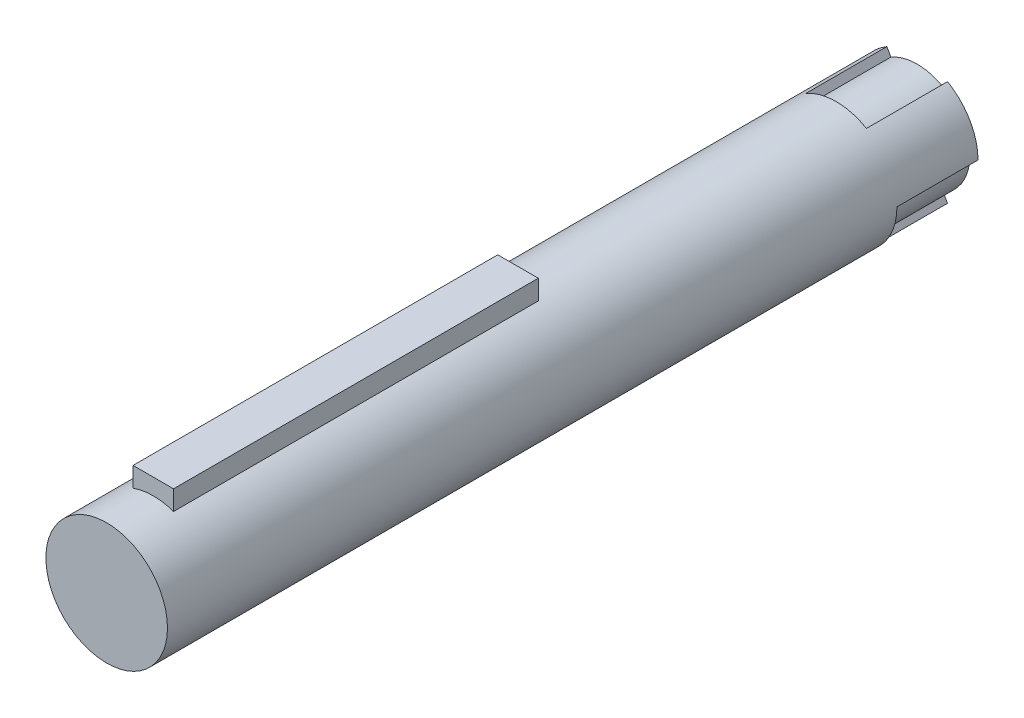
ISO-10303-21;
HEADER;
FILE_DESCRIPTION(('STEP AP214'),'2;1');
FILE_NAME('part.step','',(''),(''),'','','');
FILE_SCHEMA(('AUTOMOTIVE_DESIGN { 1 0 10303 214 1 1 1 1 }'));
ENDSEC;
DATA;
#1=APPLICATION_CONTEXT('core data for automotive mechanical design processes');
#2=APPLICATION_PROTOCOL_DEFINITION('international standard','automotive_design',2000,#1);
#3=PRODUCT_CONTEXT('',#1,'mechanical');
#4=PRODUCT('Part','Part','',(#3));
#5=PRODUCT_RELATED_PRODUCT_CATEGORY('part','',(#4));
#6=PRODUCT_DEFINITION_FORMATION('','',#4);
#7=PRODUCT_DEFINITION_CONTEXT('part definition',#1,'design');
#8=PRODUCT_DEFINITION('design','',#6,#7);
#9=PRODUCT_DEFINITION_SHAPE('','',#8);
#10=(LENGTH_UNIT() NAMED_UNIT(*) SI_UNIT(.MILLI.,.METRE.));
#11=(NAMED_UNIT(*) PLANE_ANGLE_UNIT() SI_UNIT($,.RADIAN.));
#12=(NAMED_UNIT(*) SI_UNIT($,.STERADIAN.) SOLID_ANGLE_UNIT());
#13=UNCERTAINTY_MEASURE_WITH_UNIT(LENGTH_MEASURE(1.E-05),#10,'distance_accuracy_value','');
#14=(GEOMETRIC_REPRESENTATION_CONTEXT(3) GLOBAL_UNCERTAINTY_ASSIGNED_CONTEXT((#13)) GLOBAL_UNIT_ASSIGNED_CONTEXT((#10,
#11,#12)) REPRESENTATION_CONTEXT('',''));
#15=CARTESIAN_POINT('',(0.,0.,0.));
#16=DIRECTION('',(0.,0.,1.));
#17=DIRECTION('',(1.,0.,0.));
#18=AXIS2_PLACEMENT_3D('',#15,#16,#17);
#19=CARTESIAN_POINT('',(0.,0.,-100.));
#20=DIRECTION('',(0.,0.,1.));
#21=DIRECTION('',(1.,0.,0.));
#22=AXIS2_PLACEMENT_3D('',#19,#20,#21);
#23=CYLINDRICAL_SURFACE('',#22,7.5);
#24=CARTESIAN_POINT('',(0.,0.,0.));
#25=DIRECTION('',(0.,0.,1.));
#26=DIRECTION('',(1.,0.,0.));
#27=AXIS2_PLACEMENT_3D('',#24,#25,#26);
#28=CIRCLE('',#27,7.5);
#29=CARTESIAN_POINT('',(7.5,0.,0.));
#30=VERTEX_POINT('',#29);
#31=EDGE_CURVE('E256',#30,#30,#28,.T.);
#32=ORIENTED_EDGE('',*,*,#31,.F.);
#33=EDGE_LOOP('',(#32));
#34=FACE_BOUND('',#33,.T.);
#35=CARTESIAN_POINT('',(0.,0.,-50.75));
#36=DIRECTION('',(0.,0.,1.));
#37=DIRECTION('',(1.,0.,0.));
#38=AXIS2_PLACEMENT_3D('',#35,#36,#37);
#39=CIRCLE('',#38,7.5);
#40=CARTESIAN_POINT('',(-2.5,7.07106781186548,-50.75));
#41=VERTEX_POINT('',#40);
#42=CARTESIAN_POINT('',(2.5,7.07106781186547,-50.75));
#43=VERTEX_POINT('',#42);
#44=EDGE_CURVE('E40',#41,#43,#39,.F.);
#45=ORIENTED_EDGE('',*,*,#44,.T.);
#46=DIRECTION('',(0.,0.,1.));
#47=VECTOR('',#46,1.);
#48=CARTESIAN_POINT('',(2.50000000000001,7.07106781186547,-100.));
#49=LINE('',#48,#47);
#50=CARTESIAN_POINT('',(2.5,7.07106781186548,-5.75000000000001));
#51=VERTEX_POINT('',#50);
#52=EDGE_CURVE('E11',#43,#51,#49,.T.);
#53=ORIENTED_EDGE('',*,*,#52,.T.);
#54=CARTESIAN_POINT('',(0.,0.,-5.75000000000001));
#55=DIRECTION('',(0.,0.,-1.));
#56=DIRECTION('',(-1.,0.,0.));
#57=AXIS2_PLACEMENT_3D('',#54,#55,#56);
#58=CIRCLE('',#57,7.5);
#59=CARTESIAN_POINT('',(-2.5,7.07106781186548,-5.75000000000001));
#60=VERTEX_POINT('',#59);
#61=EDGE_CURVE('E260',#51,#60,#58,.F.);
#62=ORIENTED_EDGE('',*,*,#61,.T.);
#63=DIRECTION('',(0.,0.,1.));
#64=VECTOR('',#63,1.);
#65=CARTESIAN_POINT('',(-2.49999999999999,7.07106781186548,-100.));
#66=LINE('',#65,#64);
#67=EDGE_CURVE('E267',#60,#41,#66,.F.);
#68=ORIENTED_EDGE('',*,*,#67,.T.);
#69=EDGE_LOOP('',(#45,#53,#62,#68));
#70=FACE_BOUND('',#69,.T.);
#71=CARTESIAN_POINT('',(0.,0.,-100.));
#72=DIRECTION('',(0.,0.,1.));
#73=DIRECTION('',(1.,0.,0.));
#74=AXIS2_PLACEMENT_3D('',#71,#72,#73);
#75=CIRCLE('',#74,7.5);
#76=CARTESIAN_POINT('',(-3.74165738677394,6.5,-100.));
#77=VERTEX_POINT('',#76);
#78=CARTESIAN_POINT('',(-7.5,0.,-100.));
#79=VERTEX_POINT('',#78);
#80=EDGE_CURVE('E257',#77,#79,#75,.T.);
#81=ORIENTED_EDGE('',*,*,#80,.T.);
#82=DIRECTION('',(0.,0.,-1.));
#83=VECTOR('',#82,1.);
#84=CARTESIAN_POINT('',(-7.5,0.,-90.));
#85=LINE('',#84,#83);
#86=CARTESIAN_POINT('',(-7.5,0.,-90.));
#87=VERTEX_POINT('',#86);
#88=EDGE_CURVE('E180',#87,#79,#85,.T.);
#89=ORIENTED_EDGE('',*,*,#88,.F.);
#90=CARTESIAN_POINT('',(0.,0.,-90.));
#91=DIRECTION('',(0.,0.,-1.));
#92=DIRECTION('',(-1.,0.,0.));
#93=AXIS2_PLACEMENT_3D('',#90,#91,#92);
#94=CIRCLE('',#93,7.5);
#95=CARTESIAN_POINT('',(-4.70481529320336,-5.8407801753567,-90.));
#96=VERTEX_POINT('',#95);
#97=EDGE_CURVE('E166',#96,#87,#94,.T.);
#98=ORIENTED_EDGE('',*,*,#97,.F.);
#99=DIRECTION('',(0.,0.,-1.));
#100=VECTOR('',#99,1.);
#101=CARTESIAN_POINT('',(-4.70481529320336,-5.8407801753567,-90.));
#102=LINE('',#101,#100);
#103=CARTESIAN_POINT('',(-4.70481529320336,-5.8407801753567,-100.));
#104=VERTEX_POINT('',#103);
#105=EDGE_CURVE('E153',#96,#104,#102,.T.);
#106=ORIENTED_EDGE('',*,*,#105,.T.);
#107=CARTESIAN_POINT('',(3.74165738677394,-6.5,-100.));
#108=VERTEX_POINT('',#107);
#109=EDGE_CURVE('E261',#104,#108,#75,.T.);
#110=ORIENTED_EDGE('',*,*,#109,.T.);
#111=DIRECTION('',(0.,0.,-1.));
#112=VECTOR('',#111,1.);
#113=CARTESIAN_POINT('',(3.74165738677394,-6.5,-90.));
#114=LINE('',#113,#112);
#115=CARTESIAN_POINT('',(3.74165738677394,-6.5,-90.));
#116=VERTEX_POINT('',#115);
#117=EDGE_CURVE('E202',#116,#108,#114,.T.);
#118=ORIENTED_EDGE('',*,*,#117,.F.);
#119=CARTESIAN_POINT('',(0.,0.,-90.));
#120=DIRECTION('',(0.,0.,-1.));
#121=DIRECTION('',(-1.,0.,0.));
#122=AXIS2_PLACEMENT_3D('',#119,#120,#121);
#123=CIRCLE('',#122,7.5);
#124=CARTESIAN_POINT('',(7.5,0.,-90.));
#125=VERTEX_POINT('',#124);
#126=EDGE_CURVE('E190',#125,#116,#123,.T.);
#127=ORIENTED_EDGE('',*,*,#126,.F.);
#128=DIRECTION('',(0.,0.,-1.));
#129=VECTOR('',#128,1.);
#130=CARTESIAN_POINT('',(7.5,0.,-90.));
#131=LINE('',#130,#129);
#132=CARTESIAN_POINT('',(7.5,0.,-100.));
#133=VERTEX_POINT('',#132);
#134=EDGE_CURVE('E204',#125,#133,#131,.T.);
#135=ORIENTED_EDGE('',*,*,#134,.T.);
#136=CARTESIAN_POINT('',(3.74165738677394,6.5,-100.));
#137=VERTEX_POINT('',#136);
#138=EDGE_CURVE('E262',#133,#137,#75,.T.);
#139=ORIENTED_EDGE('',*,*,#138,.T.);
#140=DIRECTION('',(0.,0.,-1.));
#141=VECTOR('',#140,1.);
#142=CARTESIAN_POINT('',(3.74165738677394,6.5,-90.));
#143=LINE('',#142,#141);
#144=CARTESIAN_POINT('',(3.74165738677394,6.5,-90.));
#145=VERTEX_POINT('',#144);
#146=EDGE_CURVE('E229',#145,#137,#143,.T.);
#147=ORIENTED_EDGE('',*,*,#146,.F.);
#148=CARTESIAN_POINT('',(0.,0.,-90.));
#149=DIRECTION('',(0.,0.,-1.));
#150=DIRECTION('',(-1.,0.,0.));
#151=AXIS2_PLACEMENT_3D('',#148,#149,#150);
#152=CIRCLE('',#151,7.5);
#153=CARTESIAN_POINT('',(-3.74165738677394,6.5,-90.));
#154=VERTEX_POINT('',#153);
#155=EDGE_CURVE('E214',#154,#145,#152,.T.);
#156=ORIENTED_EDGE('',*,*,#155,.F.);
#157=DIRECTION('',(0.,0.,-1.));
#158=VECTOR('',#157,1.);
#159=CARTESIAN_POINT('',(-3.74165738677394,6.5,-90.));
#160=LINE('',#159,#158);
#161=EDGE_CURVE('E232',#154,#77,#160,.T.);
#162=ORIENTED_EDGE('',*,*,#161,.T.);
#163=EDGE_LOOP('',(#81,#89,#98,#106,#110,#118,#127,#135,#139,#147,#156,#162));
#164=FACE_BOUND('',#163,.T.);
#165=ADVANCED_FACE('F33',(#34,#70,#164),#23,.T.);
#166=CARTESIAN_POINT('',(0.,0.,-100.));
#167=DIRECTION('',(0.,0.,1.));
#168=DIRECTION('',(1.,0.,0.));
#169=AXIS2_PLACEMENT_3D('',#166,#167,#168);
#170=PLANE('',#169);
#171=DIRECTION('',(-1.,0.,0.));
#172=VECTOR('',#171,1.);
#173=CARTESIAN_POINT('',(0.,0.,-100.));
#174=LINE('',#173,#172);
#175=CARTESIAN_POINT('',(-6.5,0.,-100.));
#176=VERTEX_POINT('',#175);
#177=EDGE_CURVE('E162',#176,#79,#174,.T.);
#178=ORIENTED_EDGE('',*,*,#177,.T.);
#179=ORIENTED_EDGE('',*,*,#80,.F.);
#180=DIRECTION('',(-0.498887651569859,0.866666666666667,0.));
#181=VECTOR('',#180,1.);
#182=CARTESIAN_POINT('',(0.,0.,-100.));
#183=LINE('',#182,#181);
#184=CARTESIAN_POINT('',(-3.24276973520408,5.63333333333334,-100.));
#185=VERTEX_POINT('',#184);
#186=EDGE_CURVE('E222',#185,#77,#183,.T.);
#187=ORIENTED_EDGE('',*,*,#186,.F.);
#188=CARTESIAN_POINT('',(0.,0.,-100.));
#189=DIRECTION('',(0.,0.,-1.));
#190=DIRECTION('',(-1.,0.,0.));
#191=AXIS2_PLACEMENT_3D('',#188,#189,#190);
#192=CIRCLE('',#191,6.5);
#193=CARTESIAN_POINT('',(3.24276973520408,5.63333333333333,-100.));
#194=VERTEX_POINT('',#193);
#195=EDGE_CURVE('E179',#185,#194,#192,.T.);
#196=ORIENTED_EDGE('',*,*,#195,.T.);
#197=DIRECTION('',(-0.498887651569859,-0.866666666666667,0.));
#198=VECTOR('',#197,1.);
#199=CARTESIAN_POINT('',(0.,0.,-100.));
#200=LINE('',#199,#198);
#201=EDGE_CURVE('E211',#137,#194,#200,.T.);
#202=ORIENTED_EDGE('',*,*,#201,.F.);
#203=ORIENTED_EDGE('',*,*,#138,.F.);
#204=DIRECTION('',(1.,0.,0.));
#205=VECTOR('',#204,1.);
#206=CARTESIAN_POINT('',(0.,0.,-100.));
#207=LINE('',#206,#205);
#208=CARTESIAN_POINT('',(6.5,0.,-100.));
#209=VERTEX_POINT('',#208);
#210=EDGE_CURVE('E197',#209,#133,#207,.T.);
#211=ORIENTED_EDGE('',*,*,#210,.F.);
#212=CARTESIAN_POINT('',(0.,0.,-100.));
#213=DIRECTION('',(0.,0.,-1.));
#214=DIRECTION('',(-1.,0.,0.));
#215=AXIS2_PLACEMENT_3D('',#212,#213,#214);
#216=CIRCLE('',#215,6.5);
#217=CARTESIAN_POINT('',(3.24276973520408,-5.63333333333333,-100.));
#218=VERTEX_POINT('',#217);
#219=EDGE_CURVE('E55',#209,#218,#216,.T.);
#220=ORIENTED_EDGE('',*,*,#219,.T.);
#221=DIRECTION('',(0.498887651569859,-0.866666666666667,0.));
#222=VECTOR('',#221,1.);
#223=CARTESIAN_POINT('',(0.,0.,-100.));
#224=LINE('',#223,#222);
#225=EDGE_CURVE('E187',#218,#108,#224,.T.);
#226=ORIENTED_EDGE('',*,*,#225,.T.);
#227=ORIENTED_EDGE('',*,*,#109,.F.);
#228=DIRECTION('',(-0.627308705760448,-0.778770690047559,0.));
#229=VECTOR('',#228,1.);
#230=CARTESIAN_POINT('',(0.,0.,-100.));
#231=LINE('',#230,#229);
#232=CARTESIAN_POINT('',(-4.07750658744291,-5.06200948530914,-100.));
#233=VERTEX_POINT('',#232);
#234=EDGE_CURVE('E172',#233,#104,#231,.T.);
#235=ORIENTED_EDGE('',*,*,#234,.F.);
#236=CARTESIAN_POINT('',(0.,0.,-100.));
#237=DIRECTION('',(0.,0.,-1.));
#238=DIRECTION('',(-1.,0.,0.));
#239=AXIS2_PLACEMENT_3D('',#236,#237,#238);
#240=CIRCLE('',#239,6.5);
#241=EDGE_CURVE('E47',#233,#176,#240,.T.);
#242=ORIENTED_EDGE('',*,*,#241,.T.);
#243=EDGE_LOOP('',(#178,#179,#187,#196,#202,#203,#211,#220,#226,#227,#235,#242));
#244=FACE_BOUND('',#243,.T.);
#245=ADVANCED_FACE('F300',(#244),#170,.F.);
#246=CARTESIAN_POINT('',(0.,0.,0.));
#247=DIRECTION('',(0.,0.,1.));
#248=DIRECTION('',(1.,0.,0.));
#249=AXIS2_PLACEMENT_3D('',#246,#247,#248);
#250=PLANE('',#249);
#251=ORIENTED_EDGE('',*,*,#31,.T.);
#252=EDGE_LOOP('',(#251));
#253=FACE_BOUND('',#252,.T.);
#254=ADVANCED_FACE('F305',(#253),#250,.T.);
#255=CARTESIAN_POINT('',(2.5,9.5,-5.75));
#256=DIRECTION('',(-1.,0.,0.));
#257=DIRECTION('',(0.,0.,1.));
#258=AXIS2_PLACEMENT_3D('',#255,#256,#257);
#259=PLANE('',#258);
#260=ORIENTED_EDGE('',*,*,#52,.F.);
#261=DIRECTION('',(0.,-1.,0.));
#262=VECTOR('',#261,1.);
#263=CARTESIAN_POINT('',(2.5,9.5,-50.75));
#264=LINE('',#263,#262);
#265=CARTESIAN_POINT('',(2.5,9.5,-50.75));
#266=VERTEX_POINT('',#265);
#267=EDGE_CURVE('E253',#266,#43,#264,.T.);
#268=ORIENTED_EDGE('',*,*,#267,.F.);
#269=DIRECTION('',(0.,0.,-1.));
#270=VECTOR('',#269,1.);
#271=CARTESIAN_POINT('',(2.5,9.5,-5.75));
#272=LINE('',#271,#270);
#273=CARTESIAN_POINT('',(2.5,9.5,-5.75));
#274=VERTEX_POINT('',#273);
#275=EDGE_CURVE('E228',#274,#266,#272,.T.);
#276=ORIENTED_EDGE('',*,*,#275,.F.);
#277=DIRECTION('',(0.,-1.,0.));
#278=VECTOR('',#277,1.);
#279=CARTESIAN_POINT('',(2.5,9.5,-5.75));
#280=LINE('',#279,#278);
#281=EDGE_CURVE('E245',#274,#51,#280,.T.);
#282=ORIENTED_EDGE('',*,*,#281,.T.);
#283=EDGE_LOOP('',(#260,#268,#276,#282));
#284=FACE_BOUND('',#283,.T.);
#285=ADVANCED_FACE('F287',(#284),#259,.F.);
#286=CARTESIAN_POINT('',(-2.5,9.5,-50.75));
#287=DIRECTION('',(0.,0.,1.));
#288=DIRECTION('',(1.,0.,0.));
#289=AXIS2_PLACEMENT_3D('',#286,#287,#288);
#290=PLANE('',#289);
#291=ORIENTED_EDGE('',*,*,#44,.F.);
#292=DIRECTION('',(0.,-1.,0.));
#293=VECTOR('',#292,1.);
#294=CARTESIAN_POINT('',(-2.5,9.5,-50.75));
#295=LINE('',#294,#293);
#296=CARTESIAN_POINT('',(-2.5,9.5,-50.75));
#297=VERTEX_POINT('',#296);
#298=EDGE_CURVE('E250',#297,#41,#295,.T.);
#299=ORIENTED_EDGE('',*,*,#298,.F.);
#300=DIRECTION('',(-1.,0.,0.));
#301=VECTOR('',#300,1.);
#302=CARTESIAN_POINT('',(-2.5,9.5,-50.75));
#303=LINE('',#302,#301);
#304=EDGE_CURVE('E239',#266,#297,#303,.T.);
#305=ORIENTED_EDGE('',*,*,#304,.F.);
#306=ORIENTED_EDGE('',*,*,#267,.T.);
#307=EDGE_LOOP('',(#291,#299,#305,#306));
#308=FACE_BOUND('',#307,.T.);
#309=ADVANCED_FACE('F275',(#308),#290,.F.);
#310=CARTESIAN_POINT('',(-2.5,9.5,-5.75));
#311=DIRECTION('',(1.,0.,0.));
#312=DIRECTION('',(0.,0.,-1.));
#313=AXIS2_PLACEMENT_3D('',#310,#311,#312);
#314=PLANE('',#313);
#315=ORIENTED_EDGE('',*,*,#67,.F.);
#316=DIRECTION('',(0.,-1.,0.));
#317=VECTOR('',#316,1.);
#318=CARTESIAN_POINT('',(-2.5,9.5,-5.75));
#319=LINE('',#318,#317);
#320=CARTESIAN_POINT('',(-2.5,9.5,-5.75));
#321=VERTEX_POINT('',#320);
#322=EDGE_CURVE('E248',#321,#60,#319,.T.);
#323=ORIENTED_EDGE('',*,*,#322,.F.);
#324=DIRECTION('',(0.,0.,1.));
#325=VECTOR('',#324,1.);
#326=CARTESIAN_POINT('',(-2.5,9.5,-5.75));
#327=LINE('',#326,#325);
#328=EDGE_CURVE('E241',#297,#321,#327,.T.);
#329=ORIENTED_EDGE('',*,*,#328,.F.);
#330=ORIENTED_EDGE('',*,*,#298,.T.);
#331=EDGE_LOOP('',(#315,#323,#329,#330));
#332=FACE_BOUND('',#331,.T.);
#333=ADVANCED_FACE('F279',(#332),#314,.F.);
#334=CARTESIAN_POINT('',(-2.5,9.5,-5.75));
#335=DIRECTION('',(0.,0.,-1.));
#336=DIRECTION('',(-1.,0.,0.));
#337=AXIS2_PLACEMENT_3D('',#334,#335,#336);
#338=PLANE('',#337);
#339=ORIENTED_EDGE('',*,*,#61,.F.);
#340=ORIENTED_EDGE('',*,*,#281,.F.);
#341=DIRECTION('',(1.,0.,0.));
#342=VECTOR('',#341,1.);
#343=CARTESIAN_POINT('',(-2.5,9.5,-5.75));
#344=LINE('',#343,#342);
#345=EDGE_CURVE('E243',#321,#274,#344,.T.);
#346=ORIENTED_EDGE('',*,*,#345,.F.);
#347=ORIENTED_EDGE('',*,*,#322,.T.);
#348=EDGE_LOOP('',(#339,#340,#346,#347));
#349=FACE_BOUND('',#348,.T.);
#350=ADVANCED_FACE('F289',(#349),#338,.F.);
#351=CARTESIAN_POINT('',(0.,9.5,0.));
#352=DIRECTION('',(0.,-1.,0.));
#353=DIRECTION('',(0.,0.,-1.));
#354=AXIS2_PLACEMENT_3D('',#351,#352,#353);
#355=PLANE('',#354);
#356=ORIENTED_EDGE('',*,*,#275,.T.);
#357=ORIENTED_EDGE('',*,*,#304,.T.);
#358=ORIENTED_EDGE('',*,*,#328,.T.);
#359=ORIENTED_EDGE('',*,*,#345,.T.);
#360=EDGE_LOOP('',(#356,#357,#358,#359));
#361=FACE_BOUND('',#360,.T.);
#362=ADVANCED_FACE('F283',(#361),#355,.F.);
#363=CARTESIAN_POINT('',(0.,0.,-90.));
#364=DIRECTION('',(0.,0.,-1.));
#365=DIRECTION('',(-1.,0.,0.));
#366=AXIS2_PLACEMENT_3D('',#363,#364,#365);
#367=CYLINDRICAL_SURFACE('',#366,6.5);
#368=ORIENTED_EDGE('',*,*,#195,.F.);
#369=DIRECTION('',(0.,0.,-1.));
#370=VECTOR('',#369,1.);
#371=CARTESIAN_POINT('',(-3.24276973520408,5.63333333333333,-90.));
#372=LINE('',#371,#370);
#373=CARTESIAN_POINT('',(-3.24276973520408,5.63333333333333,-90.));
#374=VERTEX_POINT('',#373);
#375=EDGE_CURVE('E219',#374,#185,#372,.T.);
#376=ORIENTED_EDGE('',*,*,#375,.F.);
#377=CARTESIAN_POINT('',(0.,0.,-90.));
#378=DIRECTION('',(0.,0.,-1.));
#379=DIRECTION('',(-1.,0.,0.));
#380=AXIS2_PLACEMENT_3D('',#377,#378,#379);
#381=CIRCLE('',#380,6.5);
#382=CARTESIAN_POINT('',(3.24276973520408,5.63333333333333,-90.));
#383=VERTEX_POINT('',#382);
#384=EDGE_CURVE('E208',#374,#383,#381,.T.);
#385=ORIENTED_EDGE('',*,*,#384,.T.);
#386=DIRECTION('',(0.,0.,-1.));
#387=VECTOR('',#386,1.);
#388=CARTESIAN_POINT('',(3.24276973520408,5.63333333333333,-90.));
#389=LINE('',#388,#387);
#390=EDGE_CURVE('E226',#383,#194,#389,.T.);
#391=ORIENTED_EDGE('',*,*,#390,.T.);
#392=EDGE_LOOP('',(#368,#376,#385,#391));
#393=FACE_BOUND('',#392,.T.);
#394=ADVANCED_FACE('F296',(#393),#367,.T.);
#395=CARTESIAN_POINT('',(0.,0.,-90.));
#396=DIRECTION('',(0.866666666666667,-0.498887651569859,0.));
#397=DIRECTION('',(0.498887651569859,0.866666666666667,0.));
#398=AXIS2_PLACEMENT_3D('',#395,#396,#397);
#399=PLANE('',#398);
#400=ORIENTED_EDGE('',*,*,#201,.T.);
#401=ORIENTED_EDGE('',*,*,#390,.F.);
#402=DIRECTION('',(-0.498887651569859,-0.866666666666667,0.));
#403=VECTOR('',#402,1.);
#404=CARTESIAN_POINT('',(0.,0.,-90.));
#405=LINE('',#404,#403);
#406=EDGE_CURVE('E216',#145,#383,#405,.T.);
#407=ORIENTED_EDGE('',*,*,#406,.F.);
#408=ORIENTED_EDGE('',*,*,#146,.T.);
#409=EDGE_LOOP('',(#400,#401,#407,#408));
#410=FACE_BOUND('',#409,.T.);
#411=ADVANCED_FACE('F344',(#410),#399,.F.);
#412=CARTESIAN_POINT('',(0.,0.,-90.));
#413=DIRECTION('',(-0.866666666666667,-0.498887651569859,0.));
#414=DIRECTION('',(0.498887651569859,-0.866666666666667,0.));
#415=AXIS2_PLACEMENT_3D('',#412,#413,#414);
#416=PLANE('',#415);
#417=ORIENTED_EDGE('',*,*,#186,.T.);
#418=ORIENTED_EDGE('',*,*,#161,.F.);
#419=DIRECTION('',(-0.498887651569859,0.866666666666667,0.));
#420=VECTOR('',#419,1.);
#421=CARTESIAN_POINT('',(0.,0.,-90.));
#422=LINE('',#421,#420);
#423=EDGE_CURVE('E210',#374,#154,#422,.T.);
#424=ORIENTED_EDGE('',*,*,#423,.F.);
#425=ORIENTED_EDGE('',*,*,#375,.T.);
#426=EDGE_LOOP('',(#417,#418,#424,#425));
#427=FACE_BOUND('',#426,.T.);
#428=ADVANCED_FACE('F354',(#427),#416,.F.);
#429=CARTESIAN_POINT('',(0.,0.,-90.));
#430=DIRECTION('',(0.,0.,-1.));
#431=DIRECTION('',(-1.,0.,0.));
#432=AXIS2_PLACEMENT_3D('',#429,#430,#431);
#433=PLANE('',#432);
#434=ORIENTED_EDGE('',*,*,#384,.F.);
#435=ORIENTED_EDGE('',*,*,#423,.T.);
#436=ORIENTED_EDGE('',*,*,#155,.T.);
#437=ORIENTED_EDGE('',*,*,#406,.T.);
#438=EDGE_LOOP('',(#434,#435,#436,#437));
#439=FACE_BOUND('',#438,.T.);
#440=ADVANCED_FACE('F364',(#439),#433,.T.);
#441=CARTESIAN_POINT('',(0.,0.,-90.));
#442=DIRECTION('',(0.,0.,-1.));
#443=DIRECTION('',(-1.,0.,0.));
#444=AXIS2_PLACEMENT_3D('',#441,#442,#443);
#445=CYLINDRICAL_SURFACE('',#444,6.5);
#446=ORIENTED_EDGE('',*,*,#219,.F.);
#447=DIRECTION('',(0.,0.,-1.));
#448=VECTOR('',#447,1.);
#449=CARTESIAN_POINT('',(6.5,0.,-90.));
#450=LINE('',#449,#448);
#451=CARTESIAN_POINT('',(6.5,0.,-90.));
#452=VERTEX_POINT('',#451);
#453=EDGE_CURVE('E195',#452,#209,#450,.T.);
#454=ORIENTED_EDGE('',*,*,#453,.F.);
#455=CARTESIAN_POINT('',(0.,0.,-90.));
#456=DIRECTION('',(0.,0.,-1.));
#457=DIRECTION('',(-1.,0.,0.));
#458=AXIS2_PLACEMENT_3D('',#455,#456,#457);
#459=CIRCLE('',#458,6.5);
#460=CARTESIAN_POINT('',(3.24276973520408,-5.63333333333333,-90.));
#461=VERTEX_POINT('',#460);
#462=EDGE_CURVE('E183',#452,#461,#459,.T.);
#463=ORIENTED_EDGE('',*,*,#462,.T.);
#464=DIRECTION('',(0.,0.,-1.));
#465=VECTOR('',#464,1.);
#466=CARTESIAN_POINT('',(3.24276973520408,-5.63333333333333,-90.));
#467=LINE('',#466,#465);
#468=EDGE_CURVE('E173',#461,#218,#467,.T.);
#469=ORIENTED_EDGE('',*,*,#468,.T.);
#470=EDGE_LOOP('',(#446,#454,#463,#469));
#471=FACE_BOUND('',#470,.T.);
#472=ADVANCED_FACE('F373',(#471),#445,.T.);
#473=CARTESIAN_POINT('',(0.,0.,-90.));
#474=DIRECTION('',(0.866666666666667,0.498887651569859,0.));
#475=DIRECTION('',(-0.498887651569859,0.866666666666667,0.));
#476=AXIS2_PLACEMENT_3D('',#473,#474,#475);
#477=PLANE('',#476);
#478=ORIENTED_EDGE('',*,*,#225,.F.);
#479=ORIENTED_EDGE('',*,*,#468,.F.);
#480=DIRECTION('',(0.498887651569859,-0.866666666666667,0.));
#481=VECTOR('',#480,1.);
#482=CARTESIAN_POINT('',(0.,0.,-90.));
#483=LINE('',#482,#481);
#484=EDGE_CURVE('E193',#461,#116,#483,.T.);
#485=ORIENTED_EDGE('',*,*,#484,.T.);
#486=ORIENTED_EDGE('',*,*,#117,.T.);
#487=EDGE_LOOP('',(#478,#479,#485,#486));
#488=FACE_BOUND('',#487,.T.);
#489=ADVANCED_FACE('F394',(#488),#477,.T.);
#490=CARTESIAN_POINT('',(0.,0.,-90.));
#491=DIRECTION('',(0.,1.,0.));
#492=DIRECTION('',(0.,0.,1.));
#493=AXIS2_PLACEMENT_3D('',#490,#491,#492);
#494=PLANE('',#493);
#495=ORIENTED_EDGE('',*,*,#210,.T.);
#496=ORIENTED_EDGE('',*,*,#134,.F.);
#497=DIRECTION('',(1.,0.,0.));
#498=VECTOR('',#497,1.);
#499=CARTESIAN_POINT('',(0.,0.,-90.));
#500=LINE('',#499,#498);
#501=EDGE_CURVE('E186',#452,#125,#500,.T.);
#502=ORIENTED_EDGE('',*,*,#501,.F.);
#503=ORIENTED_EDGE('',*,*,#453,.T.);
#504=EDGE_LOOP('',(#495,#496,#502,#503));
#505=FACE_BOUND('',#504,.T.);
#506=ADVANCED_FACE('F403',(#505),#494,.F.);
#507=CARTESIAN_POINT('',(0.,0.,-90.));
#508=DIRECTION('',(0.,0.,-1.));
#509=DIRECTION('',(-1.,0.,0.));
#510=AXIS2_PLACEMENT_3D('',#507,#508,#509);
#511=PLANE('',#510);
#512=ORIENTED_EDGE('',*,*,#462,.F.);
#513=ORIENTED_EDGE('',*,*,#501,.T.);
#514=ORIENTED_EDGE('',*,*,#126,.T.);
#515=ORIENTED_EDGE('',*,*,#484,.F.);
#516=EDGE_LOOP('',(#512,#513,#514,#515));
#517=FACE_BOUND('',#516,.T.);
#518=ADVANCED_FACE('F413',(#517),#511,.T.);
#519=CARTESIAN_POINT('',(0.,0.,-90.));
#520=DIRECTION('',(0.,0.,-1.));
#521=DIRECTION('',(-1.,0.,0.));
#522=AXIS2_PLACEMENT_3D('',#519,#520,#521);
#523=CYLINDRICAL_SURFACE('',#522,6.5);
#524=ORIENTED_EDGE('',*,*,#241,.F.);
#525=DIRECTION('',(0.,0.,-1.));
#526=VECTOR('',#525,1.);
#527=CARTESIAN_POINT('',(-4.07750658744291,-5.06200948530914,-90.));
#528=LINE('',#527,#526);
#529=CARTESIAN_POINT('',(-4.07750658744291,-5.06200948530914,-90.));
#530=VERTEX_POINT('',#529);
#531=EDGE_CURVE('E145',#530,#233,#528,.T.);
#532=ORIENTED_EDGE('',*,*,#531,.F.);
#533=CARTESIAN_POINT('',(0.,0.,-90.));
#534=DIRECTION('',(0.,0.,-1.));
#535=DIRECTION('',(-1.,0.,0.));
#536=AXIS2_PLACEMENT_3D('',#533,#534,#535);
#537=CIRCLE('',#536,6.5);
#538=CARTESIAN_POINT('',(-6.5,0.,-90.));
#539=VERTEX_POINT('',#538);
#540=EDGE_CURVE('E148',#530,#539,#537,.T.);
#541=ORIENTED_EDGE('',*,*,#540,.T.);
#542=DIRECTION('',(0.,0.,-1.));
#543=VECTOR('',#542,1.);
#544=CARTESIAN_POINT('',(-6.5,0.,-90.));
#545=LINE('',#544,#543);
#546=EDGE_CURVE('E177',#539,#176,#545,.T.);
#547=ORIENTED_EDGE('',*,*,#546,.T.);
#548=EDGE_LOOP('',(#524,#532,#541,#547));
#549=FACE_BOUND('',#548,.T.);
#550=ADVANCED_FACE('F147',(#549),#523,.T.);
#551=CARTESIAN_POINT('',(0.,0.,-90.));
#552=DIRECTION('',(0.,-1.,0.));
#553=DIRECTION('',(0.,0.,-1.));
#554=AXIS2_PLACEMENT_3D('',#551,#552,#553);
#555=PLANE('',#554);
#556=ORIENTED_EDGE('',*,*,#177,.F.);
#557=ORIENTED_EDGE('',*,*,#546,.F.);
#558=DIRECTION('',(-1.,0.,0.));
#559=VECTOR('',#558,1.);
#560=CARTESIAN_POINT('',(0.,0.,-90.));
#561=LINE('',#560,#559);
#562=EDGE_CURVE('E154',#539,#87,#561,.T.);
#563=ORIENTED_EDGE('',*,*,#562,.T.);
#564=ORIENTED_EDGE('',*,*,#88,.T.);
#565=EDGE_LOOP('',(#556,#557,#563,#564));
#566=FACE_BOUND('',#565,.T.);
#567=ADVANCED_FACE('F432',(#566),#555,.T.);
#568=CARTESIAN_POINT('',(0.,0.,-90.));
#569=DIRECTION('',(0.778770690047559,-0.627308705760448,0.));
#570=DIRECTION('',(0.627308705760448,0.778770690047559,0.));
#571=AXIS2_PLACEMENT_3D('',#568,#569,#570);
#572=PLANE('',#571);
#573=ORIENTED_EDGE('',*,*,#234,.T.);
#574=ORIENTED_EDGE('',*,*,#105,.F.);
#575=DIRECTION('',(-0.627308705760448,-0.778770690047559,0.));
#576=VECTOR('',#575,1.);
#577=CARTESIAN_POINT('',(0.,0.,-90.));
#578=LINE('',#577,#576);
#579=EDGE_CURVE('E160',#530,#96,#578,.T.);
#580=ORIENTED_EDGE('',*,*,#579,.F.);
#581=ORIENTED_EDGE('',*,*,#531,.T.);
#582=EDGE_LOOP('',(#573,#574,#580,#581));
#583=FACE_BOUND('',#582,.T.);
#584=ADVANCED_FACE('F164',(#583),#572,.F.);
#585=CARTESIAN_POINT('',(0.,0.,-90.));
#586=DIRECTION('',(0.,0.,-1.));
#587=DIRECTION('',(-1.,0.,0.));
#588=AXIS2_PLACEMENT_3D('',#585,#586,#587);
#589=PLANE('',#588);
#590=ORIENTED_EDGE('',*,*,#540,.F.);
#591=ORIENTED_EDGE('',*,*,#579,.T.);
#592=ORIENTED_EDGE('',*,*,#97,.T.);
#593=ORIENTED_EDGE('',*,*,#562,.F.);
#594=EDGE_LOOP('',(#590,#591,#592,#593));
#595=FACE_BOUND('',#594,.T.);
#596=ADVANCED_FACE('F158',(#595),#589,.T.);
#597=CLOSED_SHELL('',(#165,#245,#254,#285,#309,#333,#350,#362,#394,#411,#428,#440,#472,#489,
#506,#518,#550,#567,#584,#596));
#598=MANIFOLD_SOLID_BREP('B2',#597);
#599=ADVANCED_BREP_SHAPE_REPRESENTATION('',(#18,#598),#14);
#600=SHAPE_DEFINITION_REPRESENTATION(#9,#599);
ENDSEC;
END-ISO-10303-21;
